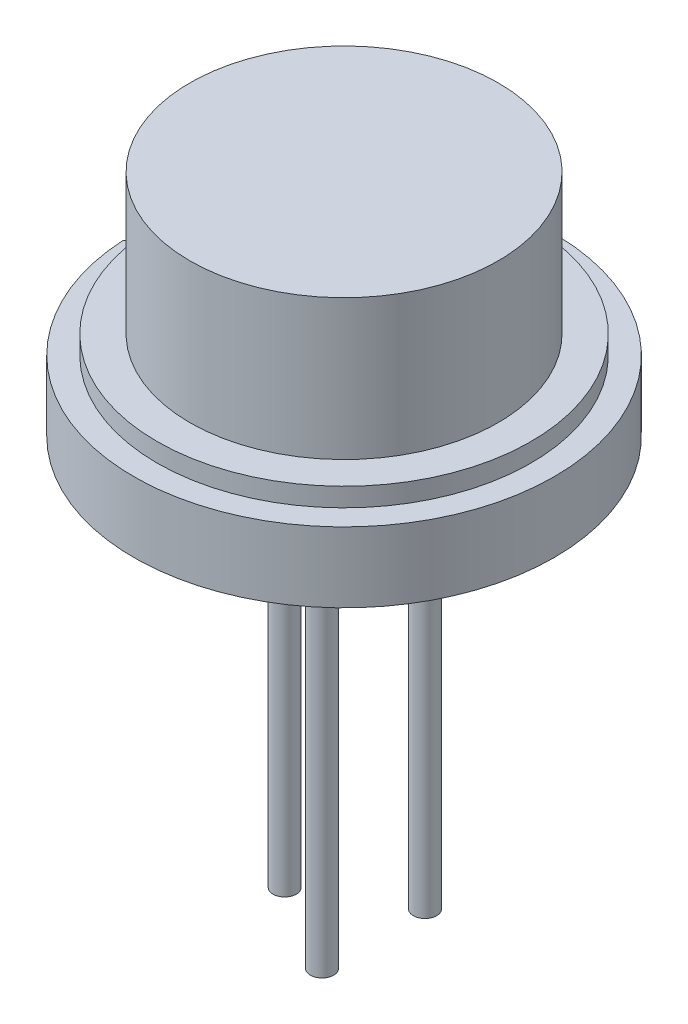
ISO-10303-21;
HEADER;
FILE_DESCRIPTION(('STEP AP214'),'2;1');
FILE_NAME('part.step','',(''),(''),'','','');
FILE_SCHEMA(('AUTOMOTIVE_DESIGN { 1 0 10303 214 1 1 1 1 }'));
ENDSEC;
DATA;
#1=APPLICATION_CONTEXT('core data for automotive mechanical design processes');
#2=APPLICATION_PROTOCOL_DEFINITION('international standard','automotive_design',2000,#1);
#3=PRODUCT_CONTEXT('',#1,'mechanical');
#4=PRODUCT('Part','Part','',(#3));
#5=PRODUCT_RELATED_PRODUCT_CATEGORY('part','',(#4));
#6=PRODUCT_DEFINITION_FORMATION('','',#4);
#7=PRODUCT_DEFINITION_CONTEXT('part definition',#1,'design');
#8=PRODUCT_DEFINITION('design','',#6,#7);
#9=PRODUCT_DEFINITION_SHAPE('','',#8);
#10=(LENGTH_UNIT() NAMED_UNIT(*) SI_UNIT(.MILLI.,.METRE.));
#11=(NAMED_UNIT(*) PLANE_ANGLE_UNIT() SI_UNIT($,.RADIAN.));
#12=(NAMED_UNIT(*) SI_UNIT($,.STERADIAN.) SOLID_ANGLE_UNIT());
#13=UNCERTAINTY_MEASURE_WITH_UNIT(LENGTH_MEASURE(1.E-05),#10,'distance_accuracy_value','');
#14=(GEOMETRIC_REPRESENTATION_CONTEXT(3) GLOBAL_UNCERTAINTY_ASSIGNED_CONTEXT((#13)) GLOBAL_UNIT_ASSIGNED_CONTEXT((#10,
#11,#12)) REPRESENTATION_CONTEXT('',''));
#15=CARTESIAN_POINT('',(0.,0.,0.));
#16=DIRECTION('',(0.,0.,1.));
#17=DIRECTION('',(1.,0.,0.));
#18=AXIS2_PLACEMENT_3D('',#15,#16,#17);
#19=CARTESIAN_POINT('',(-1.27,9.,0.));
#20=DIRECTION('',(0.,-1.,0.));
#21=DIRECTION('',(0.,0.,-1.));
#22=AXIS2_PLACEMENT_3D('',#19,#20,#21);
#23=CYLINDRICAL_SURFACE('',#22,0.25);
#24=CARTESIAN_POINT('',(-1.27,9.,0.));
#25=DIRECTION('',(0.,1.,0.));
#26=DIRECTION('',(0.,0.,1.));
#27=AXIS2_PLACEMENT_3D('',#24,#25,#26);
#28=CIRCLE('',#27,0.25);
#29=CARTESIAN_POINT('',(-1.27,9.,0.25));
#30=VERTEX_POINT('',#29);
#31=EDGE_CURVE('E92',#30,#30,#28,.T.);
#32=ORIENTED_EDGE('',*,*,#31,.F.);
#33=EDGE_LOOP('',(#32));
#34=FACE_BOUND('',#33,.T.);
#35=CARTESIAN_POINT('',(-1.27,0.,0.));
#36=DIRECTION('',(0.,1.,0.));
#37=DIRECTION('',(0.,0.,1.));
#38=AXIS2_PLACEMENT_3D('',#35,#36,#37);
#39=CIRCLE('',#38,0.25);
#40=CARTESIAN_POINT('',(-1.27,0.,0.25));
#41=VERTEX_POINT('',#40);
#42=EDGE_CURVE('E89',#41,#41,#39,.T.);
#43=ORIENTED_EDGE('',*,*,#42,.T.);
#44=EDGE_LOOP('',(#43));
#45=FACE_BOUND('',#44,.T.);
#46=ADVANCED_FACE('F35',(#34,#45),#23,.T.);
#47=CARTESIAN_POINT('',(-1.27,0.,0.));
#48=DIRECTION('',(0.,1.,0.));
#49=DIRECTION('',(0.,0.,1.));
#50=AXIS2_PLACEMENT_3D('',#47,#48,#49);
#51=PLANE('',#50);
#52=ORIENTED_EDGE('',*,*,#42,.F.);
#53=EDGE_LOOP('',(#52));
#54=FACE_BOUND('',#53,.T.);
#55=ADVANCED_FACE('F140',(#54),#51,.F.);
#56=CARTESIAN_POINT('',(-4.24734040101171,10.5,0.));
#57=DIRECTION('',(0.707106781186552,0.,0.707106781186543));
#58=DIRECTION('',(0.707106781186543,0.,-0.707106781186552));
#59=AXIS2_PLACEMENT_3D('',#56,#57,#58);
#60=PLANE('',#59);
#61=DIRECTION('',(-0.707106781186543,0.,0.707106781186552));
#62=VECTOR('',#61,1.);
#63=CARTESIAN_POINT('',(-4.24734040101171,9.,0.));
#64=LINE('',#63,#62);
#65=CARTESIAN_POINT('',(-4.24734040101171,9.,0.));
#66=VERTEX_POINT('',#65);
#67=CARTESIAN_POINT('',(-4.49327457243874,9.,0.245934171427026));
#68=VERTEX_POINT('',#67);
#69=EDGE_CURVE('E88',#66,#68,#64,.T.);
#70=ORIENTED_EDGE('',*,*,#69,.T.);
#71=DIRECTION('',(0.,-1.,0.));
#72=VECTOR('',#71,1.);
#73=CARTESIAN_POINT('',(-4.49327457243874,10.5,0.245934171427026));
#74=LINE('',#73,#72);
#75=CARTESIAN_POINT('',(-4.49327457243874,10.5,0.245934171427026));
#76=VERTEX_POINT('',#75);
#77=EDGE_CURVE('E77',#76,#68,#74,.T.);
#78=ORIENTED_EDGE('',*,*,#77,.F.);
#79=DIRECTION('',(-0.707106781186543,0.,0.707106781186552));
#80=VECTOR('',#79,1.);
#81=CARTESIAN_POINT('',(-4.24734040101171,10.5,0.));
#82=LINE('',#81,#80);
#83=CARTESIAN_POINT('',(-4.24734040101171,10.5,0.));
#84=VERTEX_POINT('',#83);
#85=EDGE_CURVE('E80',#84,#76,#82,.T.);
#86=ORIENTED_EDGE('',*,*,#85,.F.);
#87=DIRECTION('',(0.,-1.,0.));
#88=VECTOR('',#87,1.);
#89=CARTESIAN_POINT('',(-4.24734040101171,10.5,0.));
#90=LINE('',#89,#88);
#91=EDGE_CURVE('E94',#84,#66,#90,.T.);
#92=ORIENTED_EDGE('',*,*,#91,.T.);
#93=EDGE_LOOP('',(#70,#78,#86,#92));
#94=FACE_BOUND('',#93,.T.);
#95=ADVANCED_FACE('F86',(#94),#60,.F.);
#96=CARTESIAN_POINT('',(0.,10.5,0.));
#97=DIRECTION('',(0.,-1.,0.));
#98=DIRECTION('',(0.,0.,-1.));
#99=AXIS2_PLACEMENT_3D('',#96,#97,#98);
#100=CYLINDRICAL_SURFACE('',#99,4.5);
#101=CARTESIAN_POINT('',(0.,9.,0.));
#102=DIRECTION('',(0.,1.,0.));
#103=DIRECTION('',(0.,0.,1.));
#104=AXIS2_PLACEMENT_3D('',#101,#102,#103);
#105=CIRCLE('',#104,4.5);
#106=CARTESIAN_POINT('',(-4.49327457243874,9.,-0.24593417142702));
#107=VERTEX_POINT('',#106);
#108=EDGE_CURVE('E66',#68,#107,#105,.T.);
#109=ORIENTED_EDGE('',*,*,#108,.T.);
#110=DIRECTION('',(0.,-1.,0.));
#111=VECTOR('',#110,1.);
#112=CARTESIAN_POINT('',(-4.49327457243874,10.5,-0.24593417142702));
#113=LINE('',#112,#111);
#114=CARTESIAN_POINT('',(-4.49327457243874,10.5,-0.24593417142702));
#115=VERTEX_POINT('',#114);
#116=EDGE_CURVE('E79',#115,#107,#113,.T.);
#117=ORIENTED_EDGE('',*,*,#116,.F.);
#118=CARTESIAN_POINT('',(0.,10.5,0.));
#119=DIRECTION('',(0.,1.,0.));
#120=DIRECTION('',(0.,0.,1.));
#121=AXIS2_PLACEMENT_3D('',#118,#119,#120);
#122=CIRCLE('',#121,4.5);
#123=EDGE_CURVE('E74',#76,#115,#122,.T.);
#124=ORIENTED_EDGE('',*,*,#123,.F.);
#125=ORIENTED_EDGE('',*,*,#77,.T.);
#126=EDGE_LOOP('',(#109,#117,#124,#125));
#127=FACE_BOUND('',#126,.T.);
#128=ADVANCED_FACE('F75',(#127),#100,.T.);
#129=CARTESIAN_POINT('',(-4.24734040101171,10.5,0.));
#130=DIRECTION('',(0.707106781186542,0.,-0.707106781186553));
#131=DIRECTION('',(-0.707106781186553,0.,-0.707106781186542));
#132=AXIS2_PLACEMENT_3D('',#129,#130,#131);
#133=PLANE('',#132);
#134=DIRECTION('',(0.707106781186552,0.,0.707106781186542));
#135=VECTOR('',#134,1.);
#136=CARTESIAN_POINT('',(-4.24734040101171,9.,0.));
#137=LINE('',#136,#135);
#138=EDGE_CURVE('E71',#107,#66,#137,.T.);
#139=ORIENTED_EDGE('',*,*,#138,.T.);
#140=ORIENTED_EDGE('',*,*,#91,.F.);
#141=DIRECTION('',(0.707106781186552,0.,0.707106781186542));
#142=VECTOR('',#141,1.);
#143=CARTESIAN_POINT('',(-4.24734040101171,10.5,0.));
#144=LINE('',#143,#142);
#145=EDGE_CURVE('E53',#115,#84,#144,.T.);
#146=ORIENTED_EDGE('',*,*,#145,.F.);
#147=ORIENTED_EDGE('',*,*,#116,.T.);
#148=EDGE_LOOP('',(#139,#140,#146,#147));
#149=FACE_BOUND('',#148,.T.);
#150=ADVANCED_FACE('F134',(#149),#133,.F.);
#151=CARTESIAN_POINT('',(0.,10.5,0.));
#152=DIRECTION('',(0.,1.,0.));
#153=DIRECTION('',(0.,0.,1.));
#154=AXIS2_PLACEMENT_3D('',#151,#152,#153);
#155=PLANE('',#154);
#156=CARTESIAN_POINT('',(0.,10.5,0.));
#157=DIRECTION('',(0.,1.,0.));
#158=DIRECTION('',(0.,0.,1.));
#159=AXIS2_PLACEMENT_3D('',#156,#157,#158);
#160=CIRCLE('',#159,4.);
#161=CARTESIAN_POINT('',(0.,10.5,4.));
#162=VERTEX_POINT('',#161);
#163=EDGE_CURVE('E44',#162,#162,#160,.T.);
#164=ORIENTED_EDGE('',*,*,#163,.F.);
#165=EDGE_LOOP('',(#164));
#166=FACE_BOUND('',#165,.T.);
#167=ORIENTED_EDGE('',*,*,#85,.T.);
#168=ORIENTED_EDGE('',*,*,#123,.T.);
#169=ORIENTED_EDGE('',*,*,#145,.T.);
#170=EDGE_LOOP('',(#167,#168,#169));
#171=FACE_BOUND('',#170,.T.);
#172=ADVANCED_FACE('F83',(#166,#171),#155,.T.);
#173=CARTESIAN_POINT('',(0.,9.,0.));
#174=DIRECTION('',(0.,1.,0.));
#175=DIRECTION('',(0.,0.,1.));
#176=AXIS2_PLACEMENT_3D('',#173,#174,#175);
#177=PLANE('',#176);
#178=CARTESIAN_POINT('',(0.630957819255057,9.,1.10217613398263));
#179=DIRECTION('',(0.,1.,0.));
#180=DIRECTION('',(0.,0.,1.));
#181=AXIS2_PLACEMENT_3D('',#178,#179,#180);
#182=CIRCLE('',#181,0.25);
#183=CARTESIAN_POINT('',(0.630957819255057,9.,1.35217613398263));
#184=VERTEX_POINT('',#183);
#185=EDGE_CURVE('E38',#184,#184,#182,.F.);
#186=ORIENTED_EDGE('',*,*,#185,.F.);
#187=EDGE_LOOP('',(#186));
#188=FACE_BOUND('',#187,.T.);
#189=CARTESIAN_POINT('',(0.630957819255057,9.,-1.10217613398263));
#190=DIRECTION('',(0.,1.,0.));
#191=DIRECTION('',(0.,0.,1.));
#192=AXIS2_PLACEMENT_3D('',#189,#190,#191);
#193=CIRCLE('',#192,0.25);
#194=CARTESIAN_POINT('',(0.630957819255057,9.,-0.852176133982633));
#195=VERTEX_POINT('',#194);
#196=EDGE_CURVE('E99',#195,#195,#193,.F.);
#197=ORIENTED_EDGE('',*,*,#196,.F.);
#198=EDGE_LOOP('',(#197));
#199=FACE_BOUND('',#198,.T.);
#200=ORIENTED_EDGE('',*,*,#31,.T.);
#201=EDGE_LOOP('',(#200));
#202=FACE_BOUND('',#201,.T.);
#203=ORIENTED_EDGE('',*,*,#69,.F.);
#204=ORIENTED_EDGE('',*,*,#138,.F.);
#205=ORIENTED_EDGE('',*,*,#108,.F.);
#206=EDGE_LOOP('',(#203,#204,#205));
#207=FACE_BOUND('',#206,.T.);
#208=ADVANCED_FACE('F123',(#188,#199,#202,#207),#177,.F.);
#209=CARTESIAN_POINT('',(0.630957819255057,9.,-1.10217613398263));
#210=DIRECTION('',(0.,-1.,0.));
#211=DIRECTION('',(0.,0.,-1.));
#212=AXIS2_PLACEMENT_3D('',#209,#210,#211);
#213=CYLINDRICAL_SURFACE('',#212,0.25);
#214=ORIENTED_EDGE('',*,*,#196,.T.);
#215=EDGE_LOOP('',(#214));
#216=FACE_BOUND('',#215,.T.);
#217=CARTESIAN_POINT('',(0.630957819255057,0.,-1.10217613398263));
#218=DIRECTION('',(0.,1.,0.));
#219=DIRECTION('',(0.,0.,1.));
#220=AXIS2_PLACEMENT_3D('',#217,#218,#219);
#221=CIRCLE('',#220,0.25);
#222=CARTESIAN_POINT('',(0.630957819255057,0.,-0.852176133982633));
#223=VERTEX_POINT('',#222);
#224=EDGE_CURVE('E116',#223,#223,#221,.T.);
#225=ORIENTED_EDGE('',*,*,#224,.T.);
#226=EDGE_LOOP('',(#225));
#227=FACE_BOUND('',#226,.T.);
#228=ADVANCED_FACE('F125',(#216,#227),#213,.T.);
#229=CARTESIAN_POINT('',(0.630957819255057,0.,-1.10217613398263));
#230=DIRECTION('',(0.,1.,0.));
#231=DIRECTION('',(0.,0.,1.));
#232=AXIS2_PLACEMENT_3D('',#229,#230,#231);
#233=PLANE('',#232);
#234=ORIENTED_EDGE('',*,*,#224,.F.);
#235=EDGE_LOOP('',(#234));
#236=FACE_BOUND('',#235,.T.);
#237=ADVANCED_FACE('F132',(#236),#233,.F.);
#238=CARTESIAN_POINT('',(0.630957819255057,9.,1.10217613398263));
#239=DIRECTION('',(0.,-1.,0.));
#240=DIRECTION('',(0.,0.,-1.));
#241=AXIS2_PLACEMENT_3D('',#238,#239,#240);
#242=CYLINDRICAL_SURFACE('',#241,0.25);
#243=ORIENTED_EDGE('',*,*,#185,.T.);
#244=EDGE_LOOP('',(#243));
#245=FACE_BOUND('',#244,.T.);
#246=CARTESIAN_POINT('',(0.630957819255057,0.,1.10217613398263));
#247=DIRECTION('',(0.,1.,0.));
#248=DIRECTION('',(0.,0.,1.));
#249=AXIS2_PLACEMENT_3D('',#246,#247,#248);
#250=CIRCLE('',#249,0.25);
#251=CARTESIAN_POINT('',(0.630957819255057,0.,1.35217613398263));
#252=VERTEX_POINT('',#251);
#253=EDGE_CURVE('E113',#252,#252,#250,.T.);
#254=ORIENTED_EDGE('',*,*,#253,.T.);
#255=EDGE_LOOP('',(#254));
#256=FACE_BOUND('',#255,.T.);
#257=ADVANCED_FACE('F219',(#245,#256),#242,.T.);
#258=CARTESIAN_POINT('',(0.630957819255057,0.,1.10217613398263));
#259=DIRECTION('',(0.,1.,0.));
#260=DIRECTION('',(0.,0.,1.));
#261=AXIS2_PLACEMENT_3D('',#258,#259,#260);
#262=PLANE('',#261);
#263=ORIENTED_EDGE('',*,*,#253,.F.);
#264=EDGE_LOOP('',(#263));
#265=FACE_BOUND('',#264,.T.);
#266=ADVANCED_FACE('F172',(#265),#262,.F.);
#267=CARTESIAN_POINT('',(0.,10.9,0.));
#268=DIRECTION('',(0.,-1.,0.));
#269=DIRECTION('',(0.,0.,-1.));
#270=AXIS2_PLACEMENT_3D('',#267,#268,#269);
#271=CYLINDRICAL_SURFACE('',#270,4.);
#272=CARTESIAN_POINT('',(0.,10.9,0.));
#273=DIRECTION('',(0.,1.,0.));
#274=DIRECTION('',(0.,0.,1.));
#275=AXIS2_PLACEMENT_3D('',#272,#273,#274);
#276=CIRCLE('',#275,4.);
#277=CARTESIAN_POINT('',(0.,10.9,4.));
#278=VERTEX_POINT('',#277);
#279=EDGE_CURVE('E112',#278,#278,#276,.T.);
#280=ORIENTED_EDGE('',*,*,#279,.F.);
#281=EDGE_LOOP('',(#280));
#282=FACE_BOUND('',#281,.T.);
#283=ORIENTED_EDGE('',*,*,#163,.T.);
#284=EDGE_LOOP('',(#283));
#285=FACE_BOUND('',#284,.T.);
#286=ADVANCED_FACE('F177',(#282,#285),#271,.T.);
#287=CARTESIAN_POINT('',(0.,10.9,0.));
#288=DIRECTION('',(0.,1.,0.));
#289=DIRECTION('',(0.,0.,1.));
#290=AXIS2_PLACEMENT_3D('',#287,#288,#289);
#291=PLANE('',#290);
#292=CARTESIAN_POINT('',(0.,10.9,0.));
#293=DIRECTION('',(0.,1.,0.));
#294=DIRECTION('',(0.,0.,1.));
#295=AXIS2_PLACEMENT_3D('',#292,#293,#294);
#296=CIRCLE('',#295,3.3);
#297=CARTESIAN_POINT('',(0.,10.9,3.3));
#298=VERTEX_POINT('',#297);
#299=EDGE_CURVE('E11',#298,#298,#296,.T.);
#300=ORIENTED_EDGE('',*,*,#299,.F.);
#301=EDGE_LOOP('',(#300));
#302=FACE_BOUND('',#301,.T.);
#303=ORIENTED_EDGE('',*,*,#279,.T.);
#304=EDGE_LOOP('',(#303));
#305=FACE_BOUND('',#304,.T.);
#306=ADVANCED_FACE('F182',(#302,#305),#291,.T.);
#307=CARTESIAN_POINT('',(0.,13.9,0.));
#308=DIRECTION('',(0.,-1.,0.));
#309=DIRECTION('',(0.,0.,-1.));
#310=AXIS2_PLACEMENT_3D('',#307,#308,#309);
#311=CYLINDRICAL_SURFACE('',#310,3.3);
#312=CARTESIAN_POINT('',(0.,13.9,0.));
#313=DIRECTION('',(0.,1.,0.));
#314=DIRECTION('',(0.,0.,1.));
#315=AXIS2_PLACEMENT_3D('',#312,#313,#314);
#316=CIRCLE('',#315,3.3);
#317=CARTESIAN_POINT('',(0.,13.9,3.3));
#318=VERTEX_POINT('',#317);
#319=EDGE_CURVE('E273',#318,#318,#316,.T.);
#320=ORIENTED_EDGE('',*,*,#319,.F.);
#321=EDGE_LOOP('',(#320));
#322=FACE_BOUND('',#321,.T.);
#323=ORIENTED_EDGE('',*,*,#299,.T.);
#324=EDGE_LOOP('',(#323));
#325=FACE_BOUND('',#324,.T.);
#326=ADVANCED_FACE('F192',(#322,#325),#311,.T.);
#327=CARTESIAN_POINT('',(0.,13.9,0.));
#328=DIRECTION('',(0.,1.,0.));
#329=DIRECTION('',(0.,0.,1.));
#330=AXIS2_PLACEMENT_3D('',#327,#328,#329);
#331=PLANE('',#330);
#332=ORIENTED_EDGE('',*,*,#319,.T.);
#333=EDGE_LOOP('',(#332));
#334=FACE_BOUND('',#333,.T.);
#335=ADVANCED_FACE('F202',(#334),#331,.T.);
#336=CLOSED_SHELL('',(#46,#55,#95,#128,#150,#172,#208,#228,#237,#257,#266,#286,#306,#326,#335));
#337=MANIFOLD_SOLID_BREP('B2',#336);
#338=ADVANCED_BREP_SHAPE_REPRESENTATION('',(#18,#337),#14);
#339=SHAPE_DEFINITION_REPRESENTATION(#9,#338);
ENDSEC;
END-ISO-10303-21;
